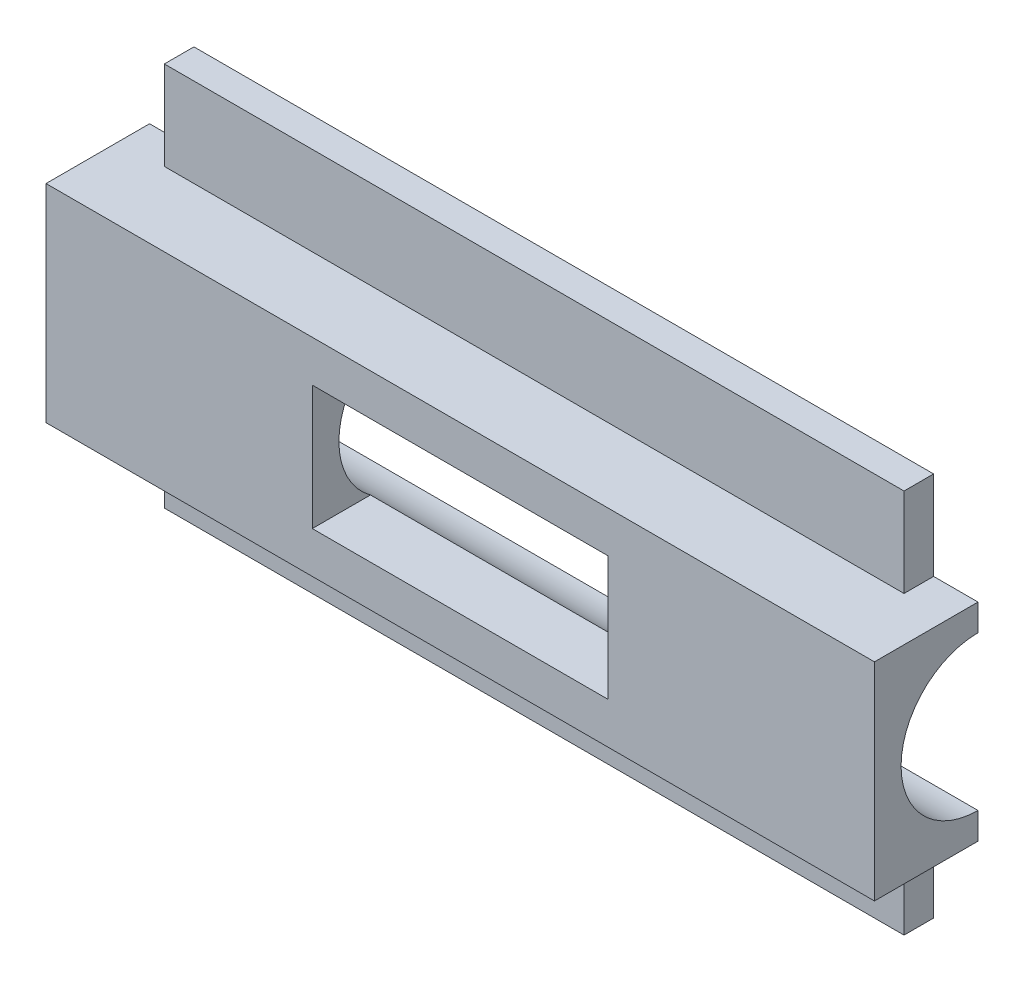
ISO-10303-21;
HEADER;
FILE_DESCRIPTION(('STEP AP214'),'2;1');
FILE_NAME('part.step','',(''),(''),'','','');
FILE_SCHEMA(('AUTOMOTIVE_DESIGN { 1 0 10303 214 1 1 1 1 }'));
ENDSEC;
DATA;
#1=APPLICATION_CONTEXT('core data for automotive mechanical design processes');
#2=APPLICATION_PROTOCOL_DEFINITION('international standard','automotive_design',2000,#1);
#3=PRODUCT_CONTEXT('',#1,'mechanical');
#4=PRODUCT('Part','Part','',(#3));
#5=PRODUCT_RELATED_PRODUCT_CATEGORY('part','',(#4));
#6=PRODUCT_DEFINITION_FORMATION('','',#4);
#7=PRODUCT_DEFINITION_CONTEXT('part definition',#1,'design');
#8=PRODUCT_DEFINITION('design','',#6,#7);
#9=PRODUCT_DEFINITION_SHAPE('','',#8);
#10=(LENGTH_UNIT() NAMED_UNIT(*) SI_UNIT(.MILLI.,.METRE.));
#11=(NAMED_UNIT(*) PLANE_ANGLE_UNIT() SI_UNIT($,.RADIAN.));
#12=(NAMED_UNIT(*) SI_UNIT($,.STERADIAN.) SOLID_ANGLE_UNIT());
#13=UNCERTAINTY_MEASURE_WITH_UNIT(LENGTH_MEASURE(1.E-05),#10,'distance_accuracy_value','');
#14=(GEOMETRIC_REPRESENTATION_CONTEXT(3) GLOBAL_UNCERTAINTY_ASSIGNED_CONTEXT((#13)) GLOBAL_UNIT_ASSIGNED_CONTEXT((#10,
#11,#12)) REPRESENTATION_CONTEXT('',''));
#15=CARTESIAN_POINT('',(0.,0.,0.));
#16=DIRECTION('',(0.,0.,1.));
#17=DIRECTION('',(1.,0.,0.));
#18=AXIS2_PLACEMENT_3D('',#15,#16,#17);
#19=CARTESIAN_POINT('',(0.,0.,0.));
#20=DIRECTION('',(0.,0.,1.));
#21=DIRECTION('',(1.,0.,0.));
#22=AXIS2_PLACEMENT_3D('',#19,#20,#21);
#23=PLANE('',#22);
#24=DIRECTION('',(0.,-1.,0.));
#25=VECTOR('',#24,1.);
#26=CARTESIAN_POINT('',(-70.,162.5,0.));
#27=LINE('',#26,#25);
#28=CARTESIAN_POINT('',(-70.,132.,0.));
#29=VERTEX_POINT('',#28);
#30=CARTESIAN_POINT('',(-70.,127.5,0.));
#31=VERTEX_POINT('',#30);
#32=EDGE_CURVE('E248',#29,#31,#27,.T.);
#33=ORIENTED_EDGE('',*,*,#32,.F.);
#34=DIRECTION('',(1.,0.,0.));
#35=VECTOR('',#34,1.);
#36=CARTESIAN_POINT('',(-106.7695526217,132.,0.));
#37=LINE('',#36,#35);
#38=CARTESIAN_POINT('',(70.,132.,0.));
#39=VERTEX_POINT('',#38);
#40=EDGE_CURVE('E288',#29,#39,#37,.T.);
#41=ORIENTED_EDGE('',*,*,#40,.T.);
#42=DIRECTION('',(0.,1.,0.));
#43=VECTOR('',#42,1.);
#44=CARTESIAN_POINT('',(70.,162.5,0.));
#45=LINE('',#44,#43);
#46=CARTESIAN_POINT('',(70.,127.5,0.));
#47=VERTEX_POINT('',#46);
#48=EDGE_CURVE('E267',#47,#39,#45,.T.);
#49=ORIENTED_EDGE('',*,*,#48,.F.);
#50=DIRECTION('',(1.,0.,0.));
#51=VECTOR('',#50,1.);
#52=CARTESIAN_POINT('',(-70.,127.5,0.));
#53=LINE('',#52,#51);
#54=CARTESIAN_POINT('',(62.5,127.5,0.));
#55=VERTEX_POINT('',#54);
#56=EDGE_CURVE('E263',#55,#47,#53,.T.);
#57=ORIENTED_EDGE('',*,*,#56,.F.);
#58=DIRECTION('',(0.,-1.,0.));
#59=VECTOR('',#58,1.);
#60=CARTESIAN_POINT('',(62.5,177.5,0.));
#61=LINE('',#60,#59);
#62=CARTESIAN_POINT('',(62.5,112.5,0.));
#63=VERTEX_POINT('',#62);
#64=EDGE_CURVE('E233',#55,#63,#61,.T.);
#65=ORIENTED_EDGE('',*,*,#64,.T.);
#66=DIRECTION('',(1.,0.,0.));
#67=VECTOR('',#66,1.);
#68=CARTESIAN_POINT('',(-62.5,112.5,0.));
#69=LINE('',#68,#67);
#70=CARTESIAN_POINT('',(-62.5,112.5,0.));
#71=VERTEX_POINT('',#70);
#72=EDGE_CURVE('E199',#71,#63,#69,.T.);
#73=ORIENTED_EDGE('',*,*,#72,.F.);
#74=DIRECTION('',(0.,-1.,0.));
#75=VECTOR('',#74,1.);
#76=CARTESIAN_POINT('',(-62.5,177.5,0.));
#77=LINE('',#76,#75);
#78=CARTESIAN_POINT('',(-62.5,127.5,0.));
#79=VERTEX_POINT('',#78);
#80=EDGE_CURVE('E220',#79,#71,#77,.T.);
#81=ORIENTED_EDGE('',*,*,#80,.F.);
#82=EDGE_CURVE('E264',#31,#79,#53,.T.);
#83=ORIENTED_EDGE('',*,*,#82,.F.);
#84=EDGE_LOOP('',(#33,#41,#49,#57,#65,#73,#81,#83));
#85=FACE_BOUND('',#84,.T.);
#86=ADVANCED_FACE('F39',(#85),#23,.F.);
#87=CARTESIAN_POINT('',(-70.,162.5,17.5));
#88=DIRECTION('',(1.,0.,0.));
#89=DIRECTION('',(0.,0.,-1.));
#90=AXIS2_PLACEMENT_3D('',#87,#88,#89);
#91=PLANE('',#90);
#92=CARTESIAN_POINT('',(-70.,162.5,0.));
#93=VERTEX_POINT('',#92);
#94=CARTESIAN_POINT('',(-70.,158.,0.));
#95=VERTEX_POINT('',#94);
#96=EDGE_CURVE('E260',#93,#95,#27,.T.);
#97=ORIENTED_EDGE('',*,*,#96,.T.);
#98=CARTESIAN_POINT('',(-70.,145.,0.));
#99=DIRECTION('',(1.,0.,0.));
#100=DIRECTION('',(0.,0.,-1.));
#101=AXIS2_PLACEMENT_3D('',#98,#99,#100);
#102=CIRCLE('',#101,13.);
#103=EDGE_CURVE('E194',#29,#95,#102,.F.);
#104=ORIENTED_EDGE('',*,*,#103,.F.);
#105=ORIENTED_EDGE('',*,*,#32,.T.);
#106=DIRECTION('',(0.,0.,-1.));
#107=VECTOR('',#106,1.);
#108=CARTESIAN_POINT('',(-70.,127.5,17.5));
#109=LINE('',#108,#107);
#110=CARTESIAN_POINT('',(-70.,127.5,17.5));
#111=VERTEX_POINT('',#110);
#112=EDGE_CURVE('E280',#111,#31,#109,.T.);
#113=ORIENTED_EDGE('',*,*,#112,.F.);
#114=DIRECTION('',(0.,-1.,0.));
#115=VECTOR('',#114,1.);
#116=CARTESIAN_POINT('',(-70.,162.5,17.5));
#117=LINE('',#116,#115);
#118=CARTESIAN_POINT('',(-70.,162.5,17.5));
#119=VERTEX_POINT('',#118);
#120=EDGE_CURVE('E249',#119,#111,#117,.T.);
#121=ORIENTED_EDGE('',*,*,#120,.F.);
#122=DIRECTION('',(0.,0.,-1.));
#123=VECTOR('',#122,1.);
#124=CARTESIAN_POINT('',(-70.,162.5,17.5));
#125=LINE('',#124,#123);
#126=EDGE_CURVE('E259',#119,#93,#125,.T.);
#127=ORIENTED_EDGE('',*,*,#126,.T.);
#128=EDGE_LOOP('',(#97,#104,#105,#113,#121,#127));
#129=FACE_BOUND('',#128,.T.);
#130=ADVANCED_FACE('F41',(#129),#91,.F.);
#131=CARTESIAN_POINT('',(-70.,127.5,17.5));
#132=DIRECTION('',(0.,1.,0.));
#133=DIRECTION('',(0.,0.,1.));
#134=AXIS2_PLACEMENT_3D('',#131,#132,#133);
#135=PLANE('',#134);
#136=ORIENTED_EDGE('',*,*,#82,.T.);
#137=DIRECTION('',(0.,0.,1.));
#138=VECTOR('',#137,1.);
#139=CARTESIAN_POINT('',(-62.5,127.5,17.5));
#140=LINE('',#139,#138);
#141=CARTESIAN_POINT('',(-62.5,127.5,5.));
#142=VERTEX_POINT('',#141);
#143=EDGE_CURVE('E244',#79,#142,#140,.T.);
#144=ORIENTED_EDGE('',*,*,#143,.T.);
#145=DIRECTION('',(1.,0.,0.));
#146=VECTOR('',#145,1.);
#147=CARTESIAN_POINT('',(-70.,127.5,5.));
#148=LINE('',#147,#146);
#149=CARTESIAN_POINT('',(62.5,127.5,5.));
#150=VERTEX_POINT('',#149);
#151=EDGE_CURVE('E246',#142,#150,#148,.T.);
#152=ORIENTED_EDGE('',*,*,#151,.T.);
#153=DIRECTION('',(0.,0.,-1.));
#154=VECTOR('',#153,1.);
#155=CARTESIAN_POINT('',(62.5,127.5,17.5));
#156=LINE('',#155,#154);
#157=EDGE_CURVE('E238',#150,#55,#156,.T.);
#158=ORIENTED_EDGE('',*,*,#157,.T.);
#159=ORIENTED_EDGE('',*,*,#56,.T.);
#160=DIRECTION('',(0.,0.,-1.));
#161=VECTOR('',#160,1.);
#162=CARTESIAN_POINT('',(70.,127.5,17.5));
#163=LINE('',#162,#161);
#164=CARTESIAN_POINT('',(70.,127.5,17.5));
#165=VERTEX_POINT('',#164);
#166=EDGE_CURVE('E277',#165,#47,#163,.T.);
#167=ORIENTED_EDGE('',*,*,#166,.F.);
#168=DIRECTION('',(1.,0.,0.));
#169=VECTOR('',#168,1.);
#170=CARTESIAN_POINT('',(-70.,127.5,17.5));
#171=LINE('',#170,#169);
#172=EDGE_CURVE('E252',#111,#165,#171,.T.);
#173=ORIENTED_EDGE('',*,*,#172,.F.);
#174=ORIENTED_EDGE('',*,*,#112,.T.);
#175=EDGE_LOOP('',(#136,#144,#152,#158,#159,#167,#173,#174));
#176=FACE_BOUND('',#175,.T.);
#177=ADVANCED_FACE('F319',(#176),#135,.F.);
#178=CARTESIAN_POINT('',(70.,162.5,17.5));
#179=DIRECTION('',(-1.,0.,0.));
#180=DIRECTION('',(0.,0.,1.));
#181=AXIS2_PLACEMENT_3D('',#178,#179,#180);
#182=PLANE('',#181);
#183=ORIENTED_EDGE('',*,*,#48,.T.);
#184=CARTESIAN_POINT('',(70.,145.,0.));
#185=DIRECTION('',(1.,0.,0.));
#186=DIRECTION('',(0.,0.,-1.));
#187=AXIS2_PLACEMENT_3D('',#184,#185,#186);
#188=CIRCLE('',#187,13.);
#189=CARTESIAN_POINT('',(70.,158.,0.));
#190=VERTEX_POINT('',#189);
#191=EDGE_CURVE('E190',#190,#39,#188,.T.);
#192=ORIENTED_EDGE('',*,*,#191,.F.);
#193=CARTESIAN_POINT('',(70.,162.5,0.));
#194=VERTEX_POINT('',#193);
#195=EDGE_CURVE('E266',#190,#194,#45,.T.);
#196=ORIENTED_EDGE('',*,*,#195,.T.);
#197=DIRECTION('',(0.,0.,-1.));
#198=VECTOR('',#197,1.);
#199=CARTESIAN_POINT('',(70.,162.5,17.5));
#200=LINE('',#199,#198);
#201=CARTESIAN_POINT('',(70.,162.5,17.5));
#202=VERTEX_POINT('',#201);
#203=EDGE_CURVE('E274',#202,#194,#200,.T.);
#204=ORIENTED_EDGE('',*,*,#203,.F.);
#205=DIRECTION('',(0.,1.,0.));
#206=VECTOR('',#205,1.);
#207=CARTESIAN_POINT('',(70.,162.5,17.5));
#208=LINE('',#207,#206);
#209=EDGE_CURVE('E255',#165,#202,#208,.T.);
#210=ORIENTED_EDGE('',*,*,#209,.F.);
#211=ORIENTED_EDGE('',*,*,#166,.T.);
#212=EDGE_LOOP('',(#183,#192,#196,#204,#210,#211));
#213=FACE_BOUND('',#212,.T.);
#214=ADVANCED_FACE('F342',(#213),#182,.F.);
#215=CARTESIAN_POINT('',(-70.,162.5,17.5));
#216=DIRECTION('',(0.,-1.,0.));
#217=DIRECTION('',(0.,0.,-1.));
#218=AXIS2_PLACEMENT_3D('',#215,#216,#217);
#219=PLANE('',#218);
#220=DIRECTION('',(-1.,0.,0.));
#221=VECTOR('',#220,1.);
#222=CARTESIAN_POINT('',(-70.,162.5,5.));
#223=LINE('',#222,#221);
#224=CARTESIAN_POINT('',(62.5,162.5,5.));
#225=VERTEX_POINT('',#224);
#226=CARTESIAN_POINT('',(-62.5,162.5,5.));
#227=VERTEX_POINT('',#226);
#228=EDGE_CURVE('E283',#225,#227,#223,.T.);
#229=ORIENTED_EDGE('',*,*,#228,.T.);
#230=DIRECTION('',(0.,0.,-1.));
#231=VECTOR('',#230,1.);
#232=CARTESIAN_POINT('',(-62.5,162.5,17.5));
#233=LINE('',#232,#231);
#234=CARTESIAN_POINT('',(-62.5,162.5,0.));
#235=VERTEX_POINT('',#234);
#236=EDGE_CURVE('E241',#227,#235,#233,.T.);
#237=ORIENTED_EDGE('',*,*,#236,.T.);
#238=DIRECTION('',(-1.,0.,0.));
#239=VECTOR('',#238,1.);
#240=CARTESIAN_POINT('',(-70.,162.5,0.));
#241=LINE('',#240,#239);
#242=EDGE_CURVE('E270',#235,#93,#241,.T.);
#243=ORIENTED_EDGE('',*,*,#242,.T.);
#244=ORIENTED_EDGE('',*,*,#126,.F.);
#245=DIRECTION('',(-1.,0.,0.));
#246=VECTOR('',#245,1.);
#247=CARTESIAN_POINT('',(-70.,162.5,17.5));
#248=LINE('',#247,#246);
#249=EDGE_CURVE('E257',#202,#119,#248,.T.);
#250=ORIENTED_EDGE('',*,*,#249,.F.);
#251=ORIENTED_EDGE('',*,*,#203,.T.);
#252=CARTESIAN_POINT('',(62.5,162.5,0.));
#253=VERTEX_POINT('',#252);
#254=EDGE_CURVE('E253',#194,#253,#241,.T.);
#255=ORIENTED_EDGE('',*,*,#254,.T.);
#256=DIRECTION('',(0.,0.,1.));
#257=VECTOR('',#256,1.);
#258=CARTESIAN_POINT('',(62.5,162.5,17.5));
#259=LINE('',#258,#257);
#260=EDGE_CURVE('E224',#253,#225,#259,.T.);
#261=ORIENTED_EDGE('',*,*,#260,.T.);
#262=EDGE_LOOP('',(#229,#237,#243,#244,#250,#251,#255,#261));
#263=FACE_BOUND('',#262,.T.);
#264=ADVANCED_FACE('F335',(#263),#219,.F.);
#265=CARTESIAN_POINT('',(0.,0.,17.5));
#266=DIRECTION('',(0.,0.,1.));
#267=DIRECTION('',(1.,0.,0.));
#268=AXIS2_PLACEMENT_3D('',#265,#266,#267);
#269=PLANE('',#268);
#270=DIRECTION('',(0.,-1.,0.));
#271=VECTOR('',#270,1.);
#272=CARTESIAN_POINT('',(-25.,155.5,17.5));
#273=LINE('',#272,#271);
#274=CARTESIAN_POINT('',(-25.,155.5,17.5));
#275=VERTEX_POINT('',#274);
#276=CARTESIAN_POINT('',(-25.,134.5,17.5));
#277=VERTEX_POINT('',#276);
#278=EDGE_CURVE('E54',#275,#277,#273,.T.);
#279=ORIENTED_EDGE('',*,*,#278,.F.);
#280=DIRECTION('',(-1.,0.,0.));
#281=VECTOR('',#280,1.);
#282=CARTESIAN_POINT('',(25.,155.5,17.5));
#283=LINE('',#282,#281);
#284=CARTESIAN_POINT('',(25.,155.5,17.5));
#285=VERTEX_POINT('',#284);
#286=EDGE_CURVE('E183',#285,#275,#283,.T.);
#287=ORIENTED_EDGE('',*,*,#286,.F.);
#288=DIRECTION('',(0.,1.,0.));
#289=VECTOR('',#288,1.);
#290=CARTESIAN_POINT('',(25.,155.5,17.5));
#291=LINE('',#290,#289);
#292=CARTESIAN_POINT('',(25.,134.5,17.5));
#293=VERTEX_POINT('',#292);
#294=EDGE_CURVE('E167',#293,#285,#291,.T.);
#295=ORIENTED_EDGE('',*,*,#294,.F.);
#296=DIRECTION('',(1.,0.,0.));
#297=VECTOR('',#296,1.);
#298=CARTESIAN_POINT('',(25.,134.5,17.5));
#299=LINE('',#298,#297);
#300=EDGE_CURVE('E176',#277,#293,#299,.T.);
#301=ORIENTED_EDGE('',*,*,#300,.F.);
#302=EDGE_LOOP('',(#279,#287,#295,#301));
#303=FACE_BOUND('',#302,.T.);
#304=ORIENTED_EDGE('',*,*,#120,.T.);
#305=ORIENTED_EDGE('',*,*,#172,.T.);
#306=ORIENTED_EDGE('',*,*,#209,.T.);
#307=ORIENTED_EDGE('',*,*,#249,.T.);
#308=EDGE_LOOP('',(#304,#305,#306,#307));
#309=FACE_BOUND('',#308,.T.);
#310=ADVANCED_FACE('F180',(#303,#309),#269,.T.);
#311=ORIENTED_EDGE('',*,*,#195,.F.);
#312=DIRECTION('',(1.,0.,0.));
#313=VECTOR('',#312,1.);
#314=CARTESIAN_POINT('',(-106.7695526217,158.,0.));
#315=LINE('',#314,#313);
#316=EDGE_CURVE('E285',#190,#95,#315,.F.);
#317=ORIENTED_EDGE('',*,*,#316,.T.);
#318=ORIENTED_EDGE('',*,*,#96,.F.);
#319=ORIENTED_EDGE('',*,*,#242,.F.);
#320=CARTESIAN_POINT('',(-62.5,177.5,0.));
#321=VERTEX_POINT('',#320);
#322=EDGE_CURVE('E234',#321,#235,#77,.T.);
#323=ORIENTED_EDGE('',*,*,#322,.F.);
#324=DIRECTION('',(1.,0.,0.));
#325=VECTOR('',#324,1.);
#326=CARTESIAN_POINT('',(-62.5,177.5,0.));
#327=LINE('',#326,#325);
#328=CARTESIAN_POINT('',(62.5,177.5,0.));
#329=VERTEX_POINT('',#328);
#330=EDGE_CURVE('E211',#321,#329,#327,.T.);
#331=ORIENTED_EDGE('',*,*,#330,.T.);
#332=EDGE_CURVE('E230',#329,#253,#61,.T.);
#333=ORIENTED_EDGE('',*,*,#332,.T.);
#334=ORIENTED_EDGE('',*,*,#254,.F.);
#335=EDGE_LOOP('',(#311,#317,#318,#319,#323,#331,#333,#334));
#336=FACE_BOUND('',#335,.T.);
#337=ADVANCED_FACE('F314',(#336),#23,.F.);
#338=CARTESIAN_POINT('',(0.,177.5,0.));
#339=DIRECTION('',(0.,1.,0.));
#340=DIRECTION('',(0.,0.,1.));
#341=AXIS2_PLACEMENT_3D('',#338,#339,#340);
#342=PLANE('',#341);
#343=DIRECTION('',(0.,0.,-1.));
#344=VECTOR('',#343,1.);
#345=CARTESIAN_POINT('',(-62.5,177.5,0.));
#346=LINE('',#345,#344);
#347=CARTESIAN_POINT('',(-62.5,177.5,5.));
#348=VERTEX_POINT('',#347);
#349=EDGE_CURVE('E208',#348,#321,#346,.T.);
#350=ORIENTED_EDGE('',*,*,#349,.F.);
#351=DIRECTION('',(-1.,0.,0.));
#352=VECTOR('',#351,1.);
#353=CARTESIAN_POINT('',(-62.5,177.5,5.));
#354=LINE('',#353,#352);
#355=CARTESIAN_POINT('',(62.5,177.5,5.));
#356=VERTEX_POINT('',#355);
#357=EDGE_CURVE('E217',#356,#348,#354,.T.);
#358=ORIENTED_EDGE('',*,*,#357,.F.);
#359=DIRECTION('',(0.,0.,1.));
#360=VECTOR('',#359,1.);
#361=CARTESIAN_POINT('',(62.5,177.5,0.));
#362=LINE('',#361,#360);
#363=EDGE_CURVE('E214',#329,#356,#362,.T.);
#364=ORIENTED_EDGE('',*,*,#363,.F.);
#365=ORIENTED_EDGE('',*,*,#330,.F.);
#366=EDGE_LOOP('',(#350,#358,#364,#365));
#367=FACE_BOUND('',#366,.T.);
#368=ADVANCED_FACE('F325',(#367),#342,.T.);
#369=CARTESIAN_POINT('',(62.5,177.5,0.));
#370=DIRECTION('',(1.,0.,0.));
#371=DIRECTION('',(0.,0.,-1.));
#372=AXIS2_PLACEMENT_3D('',#369,#370,#371);
#373=PLANE('',#372);
#374=ORIENTED_EDGE('',*,*,#260,.F.);
#375=ORIENTED_EDGE('',*,*,#332,.F.);
#376=ORIENTED_EDGE('',*,*,#363,.T.);
#377=DIRECTION('',(0.,-1.,0.));
#378=VECTOR('',#377,1.);
#379=CARTESIAN_POINT('',(62.5,177.5,5.));
#380=LINE('',#379,#378);
#381=EDGE_CURVE('E226',#356,#225,#380,.T.);
#382=ORIENTED_EDGE('',*,*,#381,.T.);
#383=EDGE_LOOP('',(#374,#375,#376,#382));
#384=FACE_BOUND('',#383,.T.);
#385=ADVANCED_FACE('F332',(#384),#373,.T.);
#386=CARTESIAN_POINT('',(-62.5,177.5,5.));
#387=DIRECTION('',(0.,0.,1.));
#388=DIRECTION('',(1.,0.,0.));
#389=AXIS2_PLACEMENT_3D('',#386,#387,#388);
#390=PLANE('',#389);
#391=ORIENTED_EDGE('',*,*,#228,.F.);
#392=ORIENTED_EDGE('',*,*,#381,.F.);
#393=ORIENTED_EDGE('',*,*,#357,.T.);
#394=DIRECTION('',(0.,-1.,0.));
#395=VECTOR('',#394,1.);
#396=CARTESIAN_POINT('',(-62.5,177.5,5.));
#397=LINE('',#396,#395);
#398=EDGE_CURVE('E221',#348,#227,#397,.T.);
#399=ORIENTED_EDGE('',*,*,#398,.T.);
#400=EDGE_LOOP('',(#391,#392,#393,#399));
#401=FACE_BOUND('',#400,.T.);
#402=ADVANCED_FACE('F364',(#401),#390,.T.);
#403=CARTESIAN_POINT('',(-62.5,177.5,0.));
#404=DIRECTION('',(-1.,0.,0.));
#405=DIRECTION('',(0.,0.,1.));
#406=AXIS2_PLACEMENT_3D('',#403,#404,#405);
#407=PLANE('',#406);
#408=ORIENTED_EDGE('',*,*,#236,.F.);
#409=ORIENTED_EDGE('',*,*,#398,.F.);
#410=ORIENTED_EDGE('',*,*,#349,.T.);
#411=ORIENTED_EDGE('',*,*,#322,.T.);
#412=EDGE_LOOP('',(#408,#409,#410,#411));
#413=FACE_BOUND('',#412,.T.);
#414=ADVANCED_FACE('F359',(#413),#407,.T.);
#415=ORIENTED_EDGE('',*,*,#151,.F.);
#416=CARTESIAN_POINT('',(-62.5,112.5,5.));
#417=VERTEX_POINT('',#416);
#418=EDGE_CURVE('E225',#142,#417,#397,.T.);
#419=ORIENTED_EDGE('',*,*,#418,.T.);
#420=DIRECTION('',(-1.,0.,0.));
#421=VECTOR('',#420,1.);
#422=CARTESIAN_POINT('',(-62.5,112.5,5.));
#423=LINE('',#422,#421);
#424=CARTESIAN_POINT('',(62.5,112.5,5.));
#425=VERTEX_POINT('',#424);
#426=EDGE_CURVE('E205',#425,#417,#423,.T.);
#427=ORIENTED_EDGE('',*,*,#426,.F.);
#428=EDGE_CURVE('E229',#150,#425,#380,.T.);
#429=ORIENTED_EDGE('',*,*,#428,.F.);
#430=EDGE_LOOP('',(#415,#419,#427,#429));
#431=FACE_BOUND('',#430,.T.);
#432=ADVANCED_FACE('F373',(#431),#390,.T.);
#433=ORIENTED_EDGE('',*,*,#143,.F.);
#434=ORIENTED_EDGE('',*,*,#80,.T.);
#435=DIRECTION('',(0.,0.,-1.));
#436=VECTOR('',#435,1.);
#437=CARTESIAN_POINT('',(-62.5,112.5,0.));
#438=LINE('',#437,#436);
#439=EDGE_CURVE('E196',#417,#71,#438,.T.);
#440=ORIENTED_EDGE('',*,*,#439,.F.);
#441=ORIENTED_EDGE('',*,*,#418,.F.);
#442=EDGE_LOOP('',(#433,#434,#440,#441));
#443=FACE_BOUND('',#442,.T.);
#444=ADVANCED_FACE('F376',(#443),#407,.T.);
#445=ORIENTED_EDGE('',*,*,#157,.F.);
#446=ORIENTED_EDGE('',*,*,#428,.T.);
#447=DIRECTION('',(0.,0.,1.));
#448=VECTOR('',#447,1.);
#449=CARTESIAN_POINT('',(62.5,112.5,0.));
#450=LINE('',#449,#448);
#451=EDGE_CURVE('E202',#63,#425,#450,.T.);
#452=ORIENTED_EDGE('',*,*,#451,.F.);
#453=ORIENTED_EDGE('',*,*,#64,.F.);
#454=EDGE_LOOP('',(#445,#446,#452,#453));
#455=FACE_BOUND('',#454,.T.);
#456=ADVANCED_FACE('F368',(#455),#373,.T.);
#457=CARTESIAN_POINT('',(0.,112.5,0.));
#458=DIRECTION('',(0.,1.,0.));
#459=DIRECTION('',(0.,0.,1.));
#460=AXIS2_PLACEMENT_3D('',#457,#458,#459);
#461=PLANE('',#460);
#462=ORIENTED_EDGE('',*,*,#439,.T.);
#463=ORIENTED_EDGE('',*,*,#72,.T.);
#464=ORIENTED_EDGE('',*,*,#451,.T.);
#465=ORIENTED_EDGE('',*,*,#426,.T.);
#466=EDGE_LOOP('',(#462,#463,#464,#465));
#467=FACE_BOUND('',#466,.T.);
#468=ADVANCED_FACE('F308',(#467),#461,.F.);
#469=CARTESIAN_POINT('',(-106.7695526217,145.,0.));
#470=DIRECTION('',(1.,0.,0.));
#471=DIRECTION('',(0.,0.,-1.));
#472=AXIS2_PLACEMENT_3D('',#469,#470,#471);
#473=CYLINDRICAL_SURFACE('',#472,13.);
#474=DIRECTION('',(1.,0.,0.));
#475=VECTOR('',#474,1.);
#476=CARTESIAN_POINT('',(-106.7695526217,155.5,7.66485485837794));
#477=LINE('',#476,#475);
#478=CARTESIAN_POINT('',(25.,155.5,7.66485485837794));
#479=VERTEX_POINT('',#478);
#480=CARTESIAN_POINT('',(-25.,155.5,7.66485485837794));
#481=VERTEX_POINT('',#480);
#482=EDGE_CURVE('E47',#479,#481,#477,.F.);
#483=ORIENTED_EDGE('',*,*,#482,.T.);
#484=CARTESIAN_POINT('',(-25.,145.,0.));
#485=DIRECTION('',(-1.,0.,0.));
#486=DIRECTION('',(0.,-1.,0.));
#487=AXIS2_PLACEMENT_3D('',#484,#485,#486);
#488=CIRCLE('',#487,13.);
#489=CARTESIAN_POINT('',(-25.,134.5,7.66485485837797));
#490=VERTEX_POINT('',#489);
#491=EDGE_CURVE('E11',#481,#490,#488,.F.);
#492=ORIENTED_EDGE('',*,*,#491,.T.);
#493=DIRECTION('',(1.,0.,0.));
#494=VECTOR('',#493,1.);
#495=CARTESIAN_POINT('',(-106.7695526217,134.5,7.66485485837797));
#496=LINE('',#495,#494);
#497=CARTESIAN_POINT('',(25.,134.5,7.66485485837797));
#498=VERTEX_POINT('',#497);
#499=EDGE_CURVE('E291',#490,#498,#496,.T.);
#500=ORIENTED_EDGE('',*,*,#499,.T.);
#501=CARTESIAN_POINT('',(25.,145.,0.));
#502=DIRECTION('',(1.,0.,0.));
#503=DIRECTION('',(0.,1.,0.));
#504=AXIS2_PLACEMENT_3D('',#501,#502,#503);
#505=CIRCLE('',#504,13.);
#506=EDGE_CURVE('E170',#498,#479,#505,.F.);
#507=ORIENTED_EDGE('',*,*,#506,.T.);
#508=EDGE_LOOP('',(#483,#492,#500,#507));
#509=FACE_BOUND('',#508,.T.);
#510=ORIENTED_EDGE('',*,*,#103,.T.);
#511=ORIENTED_EDGE('',*,*,#316,.F.);
#512=ORIENTED_EDGE('',*,*,#191,.T.);
#513=ORIENTED_EDGE('',*,*,#40,.F.);
#514=EDGE_LOOP('',(#510,#511,#512,#513));
#515=FACE_BOUND('',#514,.T.);
#516=ADVANCED_FACE('F295',(#509,#515),#473,.F.);
#517=CARTESIAN_POINT('',(-25.,155.5,0.));
#518=DIRECTION('',(-1.,0.,0.));
#519=DIRECTION('',(0.,-1.,0.));
#520=AXIS2_PLACEMENT_3D('',#517,#518,#519);
#521=PLANE('',#520);
#522=DIRECTION('',(0.,0.,1.));
#523=VECTOR('',#522,1.);
#524=CARTESIAN_POINT('',(-25.,155.5,0.));
#525=LINE('',#524,#523);
#526=EDGE_CURVE('E188',#481,#275,#525,.T.);
#527=ORIENTED_EDGE('',*,*,#526,.T.);
#528=ORIENTED_EDGE('',*,*,#278,.T.);
#529=DIRECTION('',(0.,0.,1.));
#530=VECTOR('',#529,1.);
#531=CARTESIAN_POINT('',(-25.,134.5,0.));
#532=LINE('',#531,#530);
#533=EDGE_CURVE('E173',#490,#277,#532,.T.);
#534=ORIENTED_EDGE('',*,*,#533,.F.);
#535=ORIENTED_EDGE('',*,*,#491,.F.);
#536=EDGE_LOOP('',(#527,#528,#534,#535));
#537=FACE_BOUND('',#536,.T.);
#538=ADVANCED_FACE('F300',(#537),#521,.F.);
#539=CARTESIAN_POINT('',(25.,155.5,0.));
#540=DIRECTION('',(0.,1.,0.));
#541=DIRECTION('',(0.,0.,1.));
#542=AXIS2_PLACEMENT_3D('',#539,#540,#541);
#543=PLANE('',#542);
#544=DIRECTION('',(0.,0.,1.));
#545=VECTOR('',#544,1.);
#546=CARTESIAN_POINT('',(25.,155.5,0.));
#547=LINE('',#546,#545);
#548=EDGE_CURVE('E172',#479,#285,#547,.T.);
#549=ORIENTED_EDGE('',*,*,#548,.T.);
#550=ORIENTED_EDGE('',*,*,#286,.T.);
#551=ORIENTED_EDGE('',*,*,#526,.F.);
#552=ORIENTED_EDGE('',*,*,#482,.F.);
#553=EDGE_LOOP('',(#549,#550,#551,#552));
#554=FACE_BOUND('',#553,.T.);
#555=ADVANCED_FACE('F299',(#554),#543,.F.);
#556=CARTESIAN_POINT('',(25.,155.5,0.));
#557=DIRECTION('',(1.,0.,0.));
#558=DIRECTION('',(0.,1.,0.));
#559=AXIS2_PLACEMENT_3D('',#556,#557,#558);
#560=PLANE('',#559);
#561=DIRECTION('',(0.,0.,1.));
#562=VECTOR('',#561,1.);
#563=CARTESIAN_POINT('',(25.,134.5,0.));
#564=LINE('',#563,#562);
#565=EDGE_CURVE('E62',#498,#293,#564,.T.);
#566=ORIENTED_EDGE('',*,*,#565,.T.);
#567=ORIENTED_EDGE('',*,*,#294,.T.);
#568=ORIENTED_EDGE('',*,*,#548,.F.);
#569=ORIENTED_EDGE('',*,*,#506,.F.);
#570=EDGE_LOOP('',(#566,#567,#568,#569));
#571=FACE_BOUND('',#570,.T.);
#572=ADVANCED_FACE('F164',(#571),#560,.F.);
#573=CARTESIAN_POINT('',(25.,134.5,0.));
#574=DIRECTION('',(0.,-1.,0.));
#575=DIRECTION('',(0.,0.,-1.));
#576=AXIS2_PLACEMENT_3D('',#573,#574,#575);
#577=PLANE('',#576);
#578=ORIENTED_EDGE('',*,*,#533,.T.);
#579=ORIENTED_EDGE('',*,*,#300,.T.);
#580=ORIENTED_EDGE('',*,*,#565,.F.);
#581=ORIENTED_EDGE('',*,*,#499,.F.);
#582=EDGE_LOOP('',(#578,#579,#580,#581));
#583=FACE_BOUND('',#582,.T.);
#584=ADVANCED_FACE('F177',(#583),#577,.F.);
#585=CLOSED_SHELL('',(#86,#130,#177,#214,#264,#310,#337,#368,#385,#402,#414,#432,#444,#456,#468,
#516,#538,#555,#572,#584));
#586=MANIFOLD_SOLID_BREP('B2',#585);
#587=ADVANCED_BREP_SHAPE_REPRESENTATION('',(#18,#586),#14);
#588=SHAPE_DEFINITION_REPRESENTATION(#9,#587);
ENDSEC;
END-ISO-10303-21;
